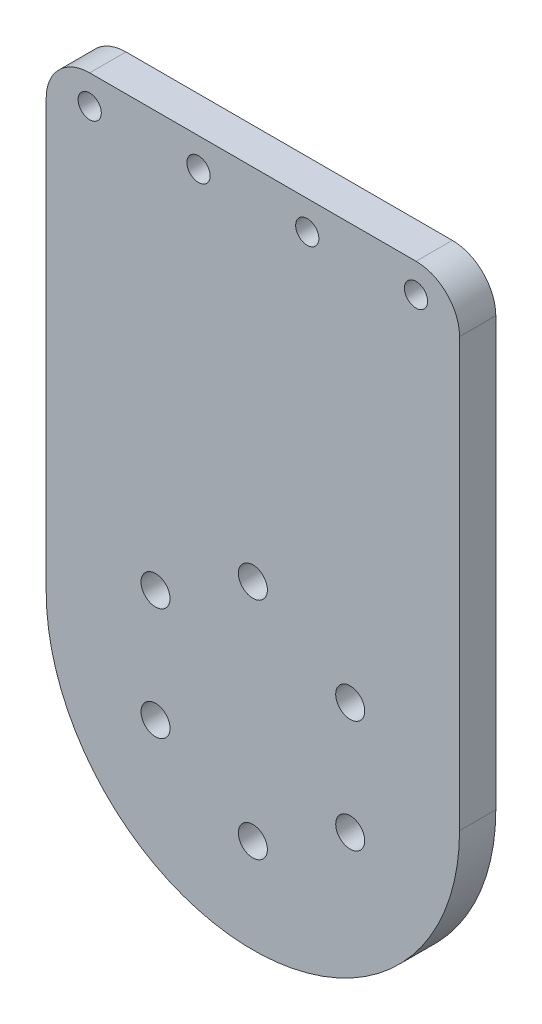
ISO-10303-21;
HEADER;
FILE_DESCRIPTION(('STEP AP214'),'2;1');
FILE_NAME('part.step','',(''),(''),'','','');
FILE_SCHEMA(('AUTOMOTIVE_DESIGN { 1 0 10303 214 1 1 1 1 }'));
ENDSEC;
DATA;
#1=APPLICATION_CONTEXT('core data for automotive mechanical design processes');
#2=APPLICATION_PROTOCOL_DEFINITION('international standard','automotive_design',2000,#1);
#3=PRODUCT_CONTEXT('',#1,'mechanical');
#4=PRODUCT('Part','Part','',(#3));
#5=PRODUCT_RELATED_PRODUCT_CATEGORY('part','',(#4));
#6=PRODUCT_DEFINITION_FORMATION('','',#4);
#7=PRODUCT_DEFINITION_CONTEXT('part definition',#1,'design');
#8=PRODUCT_DEFINITION('design','',#6,#7);
#9=PRODUCT_DEFINITION_SHAPE('','',#8);
#10=(LENGTH_UNIT() NAMED_UNIT(*) SI_UNIT(.MILLI.,.METRE.));
#11=(NAMED_UNIT(*) PLANE_ANGLE_UNIT() SI_UNIT($,.RADIAN.));
#12=(NAMED_UNIT(*) SI_UNIT($,.STERADIAN.) SOLID_ANGLE_UNIT());
#13=UNCERTAINTY_MEASURE_WITH_UNIT(LENGTH_MEASURE(1.E-05),#10,'distance_accuracy_value','');
#14=(GEOMETRIC_REPRESENTATION_CONTEXT(3) GLOBAL_UNCERTAINTY_ASSIGNED_CONTEXT((#13)) GLOBAL_UNIT_ASSIGNED_CONTEXT((#10,
#11,#12)) REPRESENTATION_CONTEXT('',''));
#15=CARTESIAN_POINT('',(0.,0.,0.));
#16=DIRECTION('',(0.,0.,1.));
#17=DIRECTION('',(1.,0.,0.));
#18=AXIS2_PLACEMENT_3D('',#15,#16,#17);
#19=CARTESIAN_POINT('',(-28.5,0.,5.));
#20=DIRECTION('',(1.,0.,0.));
#21=DIRECTION('',(0.,1.,0.));
#22=AXIS2_PLACEMENT_3D('',#19,#20,#21);
#23=PLANE('',#22);
#24=DIRECTION('',(0.,-1.,0.));
#25=VECTOR('',#24,1.);
#26=CARTESIAN_POINT('',(-28.5,0.,5.));
#27=LINE('',#26,#25);
#28=CARTESIAN_POINT('',(-28.5,59.,5.));
#29=VERTEX_POINT('',#28);
#30=CARTESIAN_POINT('',(-28.5,0.,5.));
#31=VERTEX_POINT('',#30);
#32=EDGE_CURVE('E94',#29,#31,#27,.T.);
#33=ORIENTED_EDGE('',*,*,#32,.F.);
#34=DIRECTION('',(0.,0.,-1.));
#35=VECTOR('',#34,1.);
#36=CARTESIAN_POINT('',(-28.5,59.,0.));
#37=LINE('',#36,#35);
#38=CARTESIAN_POINT('',(-28.5,59.,0.));
#39=VERTEX_POINT('',#38);
#40=EDGE_CURVE('E123',#29,#39,#37,.T.);
#41=ORIENTED_EDGE('',*,*,#40,.T.);
#42=DIRECTION('',(0.,-1.,0.));
#43=VECTOR('',#42,1.);
#44=CARTESIAN_POINT('',(-28.5,0.,0.));
#45=LINE('',#44,#43);
#46=CARTESIAN_POINT('',(-28.5,0.,0.));
#47=VERTEX_POINT('',#46);
#48=EDGE_CURVE('E120',#39,#47,#45,.T.);
#49=ORIENTED_EDGE('',*,*,#48,.T.);
#50=DIRECTION('',(0.,0.,-1.));
#51=VECTOR('',#50,1.);
#52=CARTESIAN_POINT('',(-28.5,0.,5.));
#53=LINE('',#52,#51);
#54=EDGE_CURVE('E113',#31,#47,#53,.T.);
#55=ORIENTED_EDGE('',*,*,#54,.F.);
#56=EDGE_LOOP('',(#33,#41,#49,#55));
#57=FACE_BOUND('',#56,.T.);
#58=ADVANCED_FACE('F42',(#57),#23,.F.);
#59=CARTESIAN_POINT('',(0.,0.,5.));
#60=DIRECTION('',(0.,0.,-1.));
#61=DIRECTION('',(-1.,0.,0.));
#62=AXIS2_PLACEMENT_3D('',#59,#60,#61);
#63=CYLINDRICAL_SURFACE('',#62,28.5);
#64=CARTESIAN_POINT('',(0.,0.,0.));
#65=DIRECTION('',(0.,0.,1.));
#66=DIRECTION('',(1.,0.,0.));
#67=AXIS2_PLACEMENT_3D('',#64,#65,#66);
#68=CIRCLE('',#67,28.5);
#69=CARTESIAN_POINT('',(28.5,0.,0.));
#70=VERTEX_POINT('',#69);
#71=EDGE_CURVE('E158',#47,#70,#68,.T.);
#72=ORIENTED_EDGE('',*,*,#71,.T.);
#73=DIRECTION('',(0.,0.,-1.));
#74=VECTOR('',#73,1.);
#75=CARTESIAN_POINT('',(28.5,0.,5.));
#76=LINE('',#75,#74);
#77=CARTESIAN_POINT('',(28.5,0.,5.));
#78=VERTEX_POINT('',#77);
#79=EDGE_CURVE('E115',#78,#70,#76,.T.);
#80=ORIENTED_EDGE('',*,*,#79,.F.);
#81=CARTESIAN_POINT('',(0.,0.,5.));
#82=DIRECTION('',(0.,0.,1.));
#83=DIRECTION('',(1.,0.,0.));
#84=AXIS2_PLACEMENT_3D('',#81,#82,#83);
#85=CIRCLE('',#84,28.5);
#86=EDGE_CURVE('E97',#31,#78,#85,.T.);
#87=ORIENTED_EDGE('',*,*,#86,.F.);
#88=ORIENTED_EDGE('',*,*,#54,.T.);
#89=EDGE_LOOP('',(#72,#80,#87,#88));
#90=FACE_BOUND('',#89,.T.);
#91=ADVANCED_FACE('F112',(#90),#63,.T.);
#92=CARTESIAN_POINT('',(28.5,0.,5.));
#93=DIRECTION('',(1.,0.,0.));
#94=DIRECTION('',(0.,1.,0.));
#95=AXIS2_PLACEMENT_3D('',#92,#93,#94);
#96=PLANE('',#95);
#97=DIRECTION('',(0.,-1.,0.));
#98=VECTOR('',#97,1.);
#99=CARTESIAN_POINT('',(28.5,0.,0.));
#100=LINE('',#99,#98);
#101=CARTESIAN_POINT('',(28.5,59.,0.));
#102=VERTEX_POINT('',#101);
#103=EDGE_CURVE('E156',#102,#70,#100,.T.);
#104=ORIENTED_EDGE('',*,*,#103,.F.);
#105=DIRECTION('',(0.,0.,-1.));
#106=VECTOR('',#105,1.);
#107=CARTESIAN_POINT('',(28.5,59.,5.));
#108=LINE('',#107,#106);
#109=CARTESIAN_POINT('',(28.5,59.,5.));
#110=VERTEX_POINT('',#109);
#111=EDGE_CURVE('E51',#102,#110,#108,.F.);
#112=ORIENTED_EDGE('',*,*,#111,.T.);
#113=DIRECTION('',(0.,-1.,0.));
#114=VECTOR('',#113,1.);
#115=CARTESIAN_POINT('',(28.5,0.,5.));
#116=LINE('',#115,#114);
#117=EDGE_CURVE('E117',#110,#78,#116,.T.);
#118=ORIENTED_EDGE('',*,*,#117,.T.);
#119=ORIENTED_EDGE('',*,*,#79,.T.);
#120=EDGE_LOOP('',(#104,#112,#118,#119));
#121=FACE_BOUND('',#120,.T.);
#122=ADVANCED_FACE('F289',(#121),#96,.T.);
#123=CARTESIAN_POINT('',(0.,65.,5.));
#124=DIRECTION('',(0.,1.,0.));
#125=DIRECTION('',(0.,0.,1.));
#126=AXIS2_PLACEMENT_3D('',#123,#124,#125);
#127=PLANE('',#126);
#128=DIRECTION('',(1.,0.,0.));
#129=VECTOR('',#128,1.);
#130=CARTESIAN_POINT('',(0.,65.,5.));
#131=LINE('',#130,#129);
#132=CARTESIAN_POINT('',(-22.5,65.,5.));
#133=VERTEX_POINT('',#132);
#134=CARTESIAN_POINT('',(22.5,65.,5.));
#135=VERTEX_POINT('',#134);
#136=EDGE_CURVE('E129',#133,#135,#131,.T.);
#137=ORIENTED_EDGE('',*,*,#136,.T.);
#138=DIRECTION('',(0.,0.,-1.));
#139=VECTOR('',#138,1.);
#140=CARTESIAN_POINT('',(22.5,65.,5.));
#141=LINE('',#140,#139);
#142=CARTESIAN_POINT('',(22.5,65.,0.));
#143=VERTEX_POINT('',#142);
#144=EDGE_CURVE('E140',#135,#143,#141,.T.);
#145=ORIENTED_EDGE('',*,*,#144,.T.);
#146=DIRECTION('',(1.,0.,0.));
#147=VECTOR('',#146,1.);
#148=CARTESIAN_POINT('',(0.,65.,0.));
#149=LINE('',#148,#147);
#150=CARTESIAN_POINT('',(-22.5,65.,0.));
#151=VERTEX_POINT('',#150);
#152=EDGE_CURVE('E107',#151,#143,#149,.T.);
#153=ORIENTED_EDGE('',*,*,#152,.F.);
#154=DIRECTION('',(0.,0.,-1.));
#155=VECTOR('',#154,1.);
#156=CARTESIAN_POINT('',(-22.5,65.,5.));
#157=LINE('',#156,#155);
#158=EDGE_CURVE('E135',#151,#133,#157,.F.);
#159=ORIENTED_EDGE('',*,*,#158,.T.);
#160=EDGE_LOOP('',(#137,#145,#153,#159));
#161=FACE_BOUND('',#160,.T.);
#162=ADVANCED_FACE('F150',(#161),#127,.T.);
#163=CARTESIAN_POINT('',(0.,0.,5.));
#164=DIRECTION('',(0.,0.,1.));
#165=DIRECTION('',(1.,0.,0.));
#166=AXIS2_PLACEMENT_3D('',#163,#164,#165);
#167=PLANE('',#166);
#168=CARTESIAN_POINT('',(-13.4233937586587,-7.75000000000016,5.));
#169=DIRECTION('',(0.,0.,1.));
#170=DIRECTION('',(0.50000000000001,-0.866025403784433,0.));
#171=AXIS2_PLACEMENT_3D('',#168,#169,#170);
#172=CIRCLE('',#171,2.00000000000001);
#173=CARTESIAN_POINT('',(-12.4233937586587,-9.48205080756903,5.));
#174=VERTEX_POINT('',#173);
#175=EDGE_CURVE('E223',#174,#174,#172,.T.);
#176=ORIENTED_EDGE('',*,*,#175,.F.);
#177=EDGE_LOOP('',(#176));
#178=FACE_BOUND('',#177,.T.);
#179=CARTESIAN_POINT('',(-13.4233937586589,7.74999999999987,5.));
#180=DIRECTION('',(0.,0.,1.));
#181=DIRECTION('',(-0.499999999999992,-0.866025403784443,0.));
#182=AXIS2_PLACEMENT_3D('',#179,#180,#181);
#183=CIRCLE('',#182,2.00000000000001);
#184=CARTESIAN_POINT('',(-14.4233937586589,6.01794919243098,5.));
#185=VERTEX_POINT('',#184);
#186=EDGE_CURVE('E222',#185,#185,#183,.T.);
#187=ORIENTED_EDGE('',*,*,#186,.F.);
#188=EDGE_LOOP('',(#187));
#189=FACE_BOUND('',#188,.T.);
#190=CARTESIAN_POINT('',(0.,15.5,5.));
#191=DIRECTION('',(0.,0.,1.));
#192=DIRECTION('',(-1.,0.,0.));
#193=AXIS2_PLACEMENT_3D('',#190,#191,#192);
#194=CIRCLE('',#193,2.00000000000001);
#195=CARTESIAN_POINT('',(-2.00000000000001,15.5,5.));
#196=VERTEX_POINT('',#195);
#197=EDGE_CURVE('E231',#196,#196,#194,.T.);
#198=ORIENTED_EDGE('',*,*,#197,.F.);
#199=EDGE_LOOP('',(#198));
#200=FACE_BOUND('',#199,.T.);
#201=CARTESIAN_POINT('',(13.4233937586588,7.75000000000006,5.));
#202=DIRECTION('',(0.,0.,1.));
#203=DIRECTION('',(-0.500000000000004,0.866025403784436,0.));
#204=AXIS2_PLACEMENT_3D('',#201,#202,#203);
#205=CIRCLE('',#204,2.00000000000001);
#206=CARTESIAN_POINT('',(12.4233937586588,9.48205080756894,5.));
#207=VERTEX_POINT('',#206);
#208=EDGE_CURVE('E239',#207,#207,#205,.T.);
#209=ORIENTED_EDGE('',*,*,#208,.F.);
#210=EDGE_LOOP('',(#209));
#211=FACE_BOUND('',#210,.T.);
#212=CARTESIAN_POINT('',(13.4233937586588,-7.74999999999997,5.));
#213=DIRECTION('',(0.,0.,1.));
#214=DIRECTION('',(0.499999999999998,0.86602540378444,0.));
#215=AXIS2_PLACEMENT_3D('',#212,#213,#214);
#216=CIRCLE('',#215,2.00000000000001);
#217=CARTESIAN_POINT('',(14.4233937586588,-6.01794919243109,5.));
#218=VERTEX_POINT('',#217);
#219=EDGE_CURVE('E213',#218,#218,#216,.T.);
#220=ORIENTED_EDGE('',*,*,#219,.F.);
#221=EDGE_LOOP('',(#220));
#222=FACE_BOUND('',#221,.T.);
#223=CARTESIAN_POINT('',(7.5,60.9999999999999,5.));
#224=DIRECTION('',(0.,0.,1.));
#225=DIRECTION('',(1.,0.,0.));
#226=AXIS2_PLACEMENT_3D('',#223,#224,#225);
#227=CIRCLE('',#226,1.6);
#228=CARTESIAN_POINT('',(9.1,60.9999999999999,5.));
#229=VERTEX_POINT('',#228);
#230=EDGE_CURVE('E195',#229,#229,#227,.T.);
#231=ORIENTED_EDGE('',*,*,#230,.F.);
#232=EDGE_LOOP('',(#231));
#233=FACE_BOUND('',#232,.T.);
#234=CARTESIAN_POINT('',(-7.5,60.9999999999998,5.));
#235=DIRECTION('',(0.,0.,1.));
#236=DIRECTION('',(1.,0.,0.));
#237=AXIS2_PLACEMENT_3D('',#234,#235,#236);
#238=CIRCLE('',#237,1.6);
#239=CARTESIAN_POINT('',(-5.9,60.9999999999998,5.));
#240=VERTEX_POINT('',#239);
#241=EDGE_CURVE('E186',#240,#240,#238,.T.);
#242=ORIENTED_EDGE('',*,*,#241,.F.);
#243=EDGE_LOOP('',(#242));
#244=FACE_BOUND('',#243,.T.);
#245=CARTESIAN_POINT('',(-22.5,60.9999999999997,5.));
#246=DIRECTION('',(0.,0.,1.));
#247=DIRECTION('',(1.,0.,0.));
#248=AXIS2_PLACEMENT_3D('',#245,#246,#247);
#249=CIRCLE('',#248,1.6);
#250=CARTESIAN_POINT('',(-20.9,60.9999999999997,5.));
#251=VERTEX_POINT('',#250);
#252=EDGE_CURVE('E202',#251,#251,#249,.T.);
#253=ORIENTED_EDGE('',*,*,#252,.F.);
#254=EDGE_LOOP('',(#253));
#255=FACE_BOUND('',#254,.T.);
#256=CARTESIAN_POINT('',(22.5,61.,5.));
#257=DIRECTION('',(0.,0.,1.));
#258=DIRECTION('',(1.,0.,0.));
#259=AXIS2_PLACEMENT_3D('',#256,#257,#258);
#260=CIRCLE('',#259,1.6);
#261=CARTESIAN_POINT('',(24.1,61.,5.));
#262=VERTEX_POINT('',#261);
#263=EDGE_CURVE('E178',#262,#262,#260,.T.);
#264=ORIENTED_EDGE('',*,*,#263,.F.);
#265=EDGE_LOOP('',(#264));
#266=FACE_BOUND('',#265,.T.);
#267=CARTESIAN_POINT('',(0.,-15.5,5.));
#268=DIRECTION('',(0.,0.,1.));
#269=DIRECTION('',(1.,0.,0.));
#270=AXIS2_PLACEMENT_3D('',#267,#268,#269);
#271=CIRCLE('',#270,2.00000000000001);
#272=CARTESIAN_POINT('',(2.00000000000001,-15.5,5.));
#273=VERTEX_POINT('',#272);
#274=EDGE_CURVE('E173',#273,#273,#271,.T.);
#275=ORIENTED_EDGE('',*,*,#274,.F.);
#276=EDGE_LOOP('',(#275));
#277=FACE_BOUND('',#276,.T.);
#278=ORIENTED_EDGE('',*,*,#117,.F.);
#279=CARTESIAN_POINT('',(22.5,59.,5.));
#280=DIRECTION('',(0.,0.,1.));
#281=DIRECTION('',(1.,0.,0.));
#282=AXIS2_PLACEMENT_3D('',#279,#280,#281);
#283=CIRCLE('',#282,6.);
#284=EDGE_CURVE('E12',#110,#135,#283,.T.);
#285=ORIENTED_EDGE('',*,*,#284,.T.);
#286=ORIENTED_EDGE('',*,*,#136,.F.);
#287=CARTESIAN_POINT('',(-22.5,59.,5.));
#288=DIRECTION('',(0.,0.,1.));
#289=DIRECTION('',(1.,0.,0.));
#290=AXIS2_PLACEMENT_3D('',#287,#288,#289);
#291=CIRCLE('',#290,6.);
#292=EDGE_CURVE('E101',#133,#29,#291,.T.);
#293=ORIENTED_EDGE('',*,*,#292,.T.);
#294=ORIENTED_EDGE('',*,*,#32,.T.);
#295=ORIENTED_EDGE('',*,*,#86,.T.);
#296=EDGE_LOOP('',(#278,#285,#286,#293,#294,#295));
#297=FACE_BOUND('',#296,.T.);
#298=ADVANCED_FACE('F96',(#178,#189,#200,#211,#222,#233,#244,#255,#266,#277,#297),#167,.T.);
#299=CARTESIAN_POINT('',(0.,0.,0.));
#300=DIRECTION('',(0.,0.,1.));
#301=DIRECTION('',(1.,0.,0.));
#302=AXIS2_PLACEMENT_3D('',#299,#300,#301);
#303=PLANE('',#302);
#304=CARTESIAN_POINT('',(-13.4233937586587,-7.75000000000016,0.));
#305=DIRECTION('',(0.,0.,1.));
#306=DIRECTION('',(1.,0.,0.));
#307=AXIS2_PLACEMENT_3D('',#304,#305,#306);
#308=CIRCLE('',#307,2.00000000000001);
#309=CARTESIAN_POINT('',(-11.4233937586587,-7.75000000000016,0.));
#310=VERTEX_POINT('',#309);
#311=EDGE_CURVE('E218',#310,#310,#308,.F.);
#312=ORIENTED_EDGE('',*,*,#311,.F.);
#313=EDGE_LOOP('',(#312));
#314=FACE_BOUND('',#313,.T.);
#315=CARTESIAN_POINT('',(-13.4233937586589,7.74999999999987,0.));
#316=DIRECTION('',(0.,0.,1.));
#317=DIRECTION('',(1.,0.,0.));
#318=AXIS2_PLACEMENT_3D('',#315,#316,#317);
#319=CIRCLE('',#318,2.00000000000001);
#320=CARTESIAN_POINT('',(-11.4233937586589,7.74999999999987,0.));
#321=VERTEX_POINT('',#320);
#322=EDGE_CURVE('E227',#321,#321,#319,.F.);
#323=ORIENTED_EDGE('',*,*,#322,.F.);
#324=EDGE_LOOP('',(#323));
#325=FACE_BOUND('',#324,.T.);
#326=CARTESIAN_POINT('',(0.,15.5,0.));
#327=DIRECTION('',(0.,0.,1.));
#328=DIRECTION('',(1.,0.,0.));
#329=AXIS2_PLACEMENT_3D('',#326,#327,#328);
#330=CIRCLE('',#329,2.00000000000001);
#331=CARTESIAN_POINT('',(2.00000000000001,15.5,0.));
#332=VERTEX_POINT('',#331);
#333=EDGE_CURVE('E235',#332,#332,#330,.F.);
#334=ORIENTED_EDGE('',*,*,#333,.F.);
#335=EDGE_LOOP('',(#334));
#336=FACE_BOUND('',#335,.T.);
#337=CARTESIAN_POINT('',(13.4233937586588,7.75000000000006,0.));
#338=DIRECTION('',(0.,0.,1.));
#339=DIRECTION('',(1.,0.,0.));
#340=AXIS2_PLACEMENT_3D('',#337,#338,#339);
#341=CIRCLE('',#340,2.00000000000001);
#342=CARTESIAN_POINT('',(15.4233937586588,7.75000000000006,0.));
#343=VERTEX_POINT('',#342);
#344=EDGE_CURVE('E217',#343,#343,#341,.F.);
#345=ORIENTED_EDGE('',*,*,#344,.F.);
#346=EDGE_LOOP('',(#345));
#347=FACE_BOUND('',#346,.T.);
#348=CARTESIAN_POINT('',(13.4233937586588,-7.74999999999997,0.));
#349=DIRECTION('',(0.,0.,1.));
#350=DIRECTION('',(1.,0.,0.));
#351=AXIS2_PLACEMENT_3D('',#348,#349,#350);
#352=CIRCLE('',#351,2.00000000000001);
#353=CARTESIAN_POINT('',(15.4233937586588,-7.74999999999997,0.));
#354=VERTEX_POINT('',#353);
#355=EDGE_CURVE('E206',#354,#354,#352,.F.);
#356=ORIENTED_EDGE('',*,*,#355,.F.);
#357=EDGE_LOOP('',(#356));
#358=FACE_BOUND('',#357,.T.);
#359=CARTESIAN_POINT('',(7.5,60.9999999999999,0.));
#360=DIRECTION('',(0.,0.,1.));
#361=DIRECTION('',(1.,0.,0.));
#362=AXIS2_PLACEMENT_3D('',#359,#360,#361);
#363=CIRCLE('',#362,1.6);
#364=CARTESIAN_POINT('',(9.1,60.9999999999999,0.));
#365=VERTEX_POINT('',#364);
#366=EDGE_CURVE('E182',#365,#365,#363,.T.);
#367=ORIENTED_EDGE('',*,*,#366,.T.);
#368=EDGE_LOOP('',(#367));
#369=FACE_BOUND('',#368,.T.);
#370=CARTESIAN_POINT('',(-7.5,60.9999999999998,0.));
#371=DIRECTION('',(0.,0.,1.));
#372=DIRECTION('',(1.,0.,0.));
#373=AXIS2_PLACEMENT_3D('',#370,#371,#372);
#374=CIRCLE('',#373,1.6);
#375=CARTESIAN_POINT('',(-5.9,60.9999999999998,0.));
#376=VERTEX_POINT('',#375);
#377=EDGE_CURVE('E190',#376,#376,#374,.T.);
#378=ORIENTED_EDGE('',*,*,#377,.T.);
#379=EDGE_LOOP('',(#378));
#380=FACE_BOUND('',#379,.T.);
#381=CARTESIAN_POINT('',(-22.5,60.9999999999997,0.));
#382=DIRECTION('',(0.,0.,1.));
#383=DIRECTION('',(1.,0.,0.));
#384=AXIS2_PLACEMENT_3D('',#381,#382,#383);
#385=CIRCLE('',#384,1.6);
#386=CARTESIAN_POINT('',(-20.9,60.9999999999997,0.));
#387=VERTEX_POINT('',#386);
#388=EDGE_CURVE('E191',#387,#387,#385,.T.);
#389=ORIENTED_EDGE('',*,*,#388,.T.);
#390=EDGE_LOOP('',(#389));
#391=FACE_BOUND('',#390,.T.);
#392=CARTESIAN_POINT('',(22.5,61.,0.));
#393=DIRECTION('',(0.,0.,1.));
#394=DIRECTION('',(1.,0.,0.));
#395=AXIS2_PLACEMENT_3D('',#392,#393,#394);
#396=CIRCLE('',#395,1.6);
#397=CARTESIAN_POINT('',(24.1,61.,0.));
#398=VERTEX_POINT('',#397);
#399=EDGE_CURVE('E177',#398,#398,#396,.T.);
#400=ORIENTED_EDGE('',*,*,#399,.T.);
#401=EDGE_LOOP('',(#400));
#402=FACE_BOUND('',#401,.T.);
#403=CARTESIAN_POINT('',(0.,-15.5,0.));
#404=DIRECTION('',(0.,0.,1.));
#405=DIRECTION('',(1.,0.,0.));
#406=AXIS2_PLACEMENT_3D('',#403,#404,#405);
#407=CIRCLE('',#406,2.00000000000001);
#408=CARTESIAN_POINT('',(2.00000000000001,-15.5,0.));
#409=VERTEX_POINT('',#408);
#410=EDGE_CURVE('E165',#409,#409,#407,.F.);
#411=ORIENTED_EDGE('',*,*,#410,.F.);
#412=EDGE_LOOP('',(#411));
#413=FACE_BOUND('',#412,.T.);
#414=ORIENTED_EDGE('',*,*,#152,.T.);
#415=CARTESIAN_POINT('',(22.5,59.,0.));
#416=DIRECTION('',(0.,0.,1.));
#417=DIRECTION('',(1.,0.,0.));
#418=AXIS2_PLACEMENT_3D('',#415,#416,#417);
#419=CIRCLE('',#418,6.);
#420=EDGE_CURVE('E65',#143,#102,#419,.F.);
#421=ORIENTED_EDGE('',*,*,#420,.T.);
#422=ORIENTED_EDGE('',*,*,#103,.T.);
#423=ORIENTED_EDGE('',*,*,#71,.F.);
#424=ORIENTED_EDGE('',*,*,#48,.F.);
#425=CARTESIAN_POINT('',(-22.5,59.,0.));
#426=DIRECTION('',(0.,0.,1.));
#427=DIRECTION('',(1.,0.,0.));
#428=AXIS2_PLACEMENT_3D('',#425,#426,#427);
#429=CIRCLE('',#428,6.);
#430=EDGE_CURVE('E127',#39,#151,#429,.F.);
#431=ORIENTED_EDGE('',*,*,#430,.T.);
#432=EDGE_LOOP('',(#414,#421,#422,#423,#424,#431));
#433=FACE_BOUND('',#432,.T.);
#434=ADVANCED_FACE('F154',(#314,#325,#336,#347,#358,#369,#380,#391,#402,#413,#433),#303,.F.);
#435=CARTESIAN_POINT('',(0.,-15.5,-0.00100000000000013));
#436=DIRECTION('',(0.,0.,1.));
#437=DIRECTION('',(1.,0.,0.));
#438=AXIS2_PLACEMENT_3D('',#435,#436,#437);
#439=CYLINDRICAL_SURFACE('',#438,2.00000000000001);
#440=ORIENTED_EDGE('',*,*,#274,.T.);
#441=EDGE_LOOP('',(#440));
#442=FACE_BOUND('',#441,.T.);
#443=ORIENTED_EDGE('',*,*,#410,.T.);
#444=EDGE_LOOP('',(#443));
#445=FACE_BOUND('',#444,.T.);
#446=ADVANCED_FACE('F269',(#442,#445),#439,.F.);
#447=CARTESIAN_POINT('',(22.5,61.,0.));
#448=DIRECTION('',(0.,0.,1.));
#449=DIRECTION('',(1.,0.,0.));
#450=AXIS2_PLACEMENT_3D('',#447,#448,#449);
#451=CYLINDRICAL_SURFACE('',#450,1.6);
#452=ORIENTED_EDGE('',*,*,#399,.F.);
#453=EDGE_LOOP('',(#452));
#454=FACE_BOUND('',#453,.T.);
#455=ORIENTED_EDGE('',*,*,#263,.T.);
#456=EDGE_LOOP('',(#455));
#457=FACE_BOUND('',#456,.T.);
#458=ADVANCED_FACE('F272',(#454,#457),#451,.F.);
#459=CARTESIAN_POINT('',(-22.5,60.9999999999997,0.));
#460=DIRECTION('',(0.,0.,1.));
#461=DIRECTION('',(1.,0.,0.));
#462=AXIS2_PLACEMENT_3D('',#459,#460,#461);
#463=CYLINDRICAL_SURFACE('',#462,1.6);
#464=ORIENTED_EDGE('',*,*,#388,.F.);
#465=EDGE_LOOP('',(#464));
#466=FACE_BOUND('',#465,.T.);
#467=ORIENTED_EDGE('',*,*,#252,.T.);
#468=EDGE_LOOP('',(#467));
#469=FACE_BOUND('',#468,.T.);
#470=ADVANCED_FACE('F375',(#466,#469),#463,.F.);
#471=CARTESIAN_POINT('',(-7.5,60.9999999999998,0.));
#472=DIRECTION('',(0.,0.,1.));
#473=DIRECTION('',(1.,0.,0.));
#474=AXIS2_PLACEMENT_3D('',#471,#472,#473);
#475=CYLINDRICAL_SURFACE('',#474,1.6);
#476=ORIENTED_EDGE('',*,*,#377,.F.);
#477=EDGE_LOOP('',(#476));
#478=FACE_BOUND('',#477,.T.);
#479=ORIENTED_EDGE('',*,*,#241,.T.);
#480=EDGE_LOOP('',(#479));
#481=FACE_BOUND('',#480,.T.);
#482=ADVANCED_FACE('F301',(#478,#481),#475,.F.);
#483=CARTESIAN_POINT('',(7.5,60.9999999999999,0.));
#484=DIRECTION('',(0.,0.,1.));
#485=DIRECTION('',(1.,0.,0.));
#486=AXIS2_PLACEMENT_3D('',#483,#484,#485);
#487=CYLINDRICAL_SURFACE('',#486,1.6);
#488=ORIENTED_EDGE('',*,*,#366,.F.);
#489=EDGE_LOOP('',(#488));
#490=FACE_BOUND('',#489,.T.);
#491=ORIENTED_EDGE('',*,*,#230,.T.);
#492=EDGE_LOOP('',(#491));
#493=FACE_BOUND('',#492,.T.);
#494=ADVANCED_FACE('F294',(#490,#493),#487,.F.);
#495=CARTESIAN_POINT('',(-22.5,59.,5.));
#496=DIRECTION('',(0.,0.,1.));
#497=DIRECTION('',(1.,0.,0.));
#498=AXIS2_PLACEMENT_3D('',#495,#496,#497);
#499=CYLINDRICAL_SURFACE('',#498,6.);
#500=ORIENTED_EDGE('',*,*,#292,.F.);
#501=ORIENTED_EDGE('',*,*,#158,.F.);
#502=ORIENTED_EDGE('',*,*,#430,.F.);
#503=ORIENTED_EDGE('',*,*,#40,.F.);
#504=EDGE_LOOP('',(#500,#501,#502,#503));
#505=FACE_BOUND('',#504,.T.);
#506=ADVANCED_FACE('F292',(#505),#499,.T.);
#507=CARTESIAN_POINT('',(22.5,59.,5.));
#508=DIRECTION('',(0.,0.,-1.));
#509=DIRECTION('',(-1.,0.,0.));
#510=AXIS2_PLACEMENT_3D('',#507,#508,#509);
#511=CYLINDRICAL_SURFACE('',#510,6.);
#512=ORIENTED_EDGE('',*,*,#284,.F.);
#513=ORIENTED_EDGE('',*,*,#111,.F.);
#514=ORIENTED_EDGE('',*,*,#420,.F.);
#515=ORIENTED_EDGE('',*,*,#144,.F.);
#516=EDGE_LOOP('',(#512,#513,#514,#515));
#517=FACE_BOUND('',#516,.T.);
#518=ADVANCED_FACE('F44',(#517),#511,.T.);
#519=CARTESIAN_POINT('',(13.4233937586588,-7.74999999999997,-0.00100000000000013));
#520=DIRECTION('',(0.,0.,1.));
#521=DIRECTION('',(1.,0.,0.));
#522=AXIS2_PLACEMENT_3D('',#519,#520,#521);
#523=CYLINDRICAL_SURFACE('',#522,2.00000000000001);
#524=ORIENTED_EDGE('',*,*,#219,.T.);
#525=EDGE_LOOP('',(#524));
#526=FACE_BOUND('',#525,.T.);
#527=ORIENTED_EDGE('',*,*,#355,.T.);
#528=EDGE_LOOP('',(#527));
#529=FACE_BOUND('',#528,.T.);
#530=ADVANCED_FACE('F300',(#526,#529),#523,.F.);
#531=CARTESIAN_POINT('',(13.4233937586588,7.75000000000006,-0.00100000000000013));
#532=DIRECTION('',(0.,0.,1.));
#533=DIRECTION('',(1.,0.,0.));
#534=AXIS2_PLACEMENT_3D('',#531,#532,#533);
#535=CYLINDRICAL_SURFACE('',#534,2.00000000000001);
#536=ORIENTED_EDGE('',*,*,#208,.T.);
#537=EDGE_LOOP('',(#536));
#538=FACE_BOUND('',#537,.T.);
#539=ORIENTED_EDGE('',*,*,#344,.T.);
#540=EDGE_LOOP('',(#539));
#541=FACE_BOUND('',#540,.T.);
#542=ADVANCED_FACE('F250',(#538,#541),#535,.F.);
#543=CARTESIAN_POINT('',(0.,15.5,-0.00100000000000013));
#544=DIRECTION('',(0.,0.,1.));
#545=DIRECTION('',(1.,0.,0.));
#546=AXIS2_PLACEMENT_3D('',#543,#544,#545);
#547=CYLINDRICAL_SURFACE('',#546,2.00000000000001);
#548=ORIENTED_EDGE('',*,*,#197,.T.);
#549=EDGE_LOOP('',(#548));
#550=FACE_BOUND('',#549,.T.);
#551=ORIENTED_EDGE('',*,*,#333,.T.);
#552=EDGE_LOOP('',(#551));
#553=FACE_BOUND('',#552,.T.);
#554=ADVANCED_FACE('F340',(#550,#553),#547,.F.);
#555=CARTESIAN_POINT('',(-13.4233937586589,7.74999999999987,-0.00100000000000013));
#556=DIRECTION('',(0.,0.,1.));
#557=DIRECTION('',(1.,0.,0.));
#558=AXIS2_PLACEMENT_3D('',#555,#556,#557);
#559=CYLINDRICAL_SURFACE('',#558,2.00000000000001);
#560=ORIENTED_EDGE('',*,*,#186,.T.);
#561=EDGE_LOOP('',(#560));
#562=FACE_BOUND('',#561,.T.);
#563=ORIENTED_EDGE('',*,*,#322,.T.);
#564=EDGE_LOOP('',(#563));
#565=FACE_BOUND('',#564,.T.);
#566=ADVANCED_FACE('F349',(#562,#565),#559,.F.);
#567=CARTESIAN_POINT('',(-13.4233937586587,-7.75000000000016,-0.00100000000000013));
#568=DIRECTION('',(0.,0.,1.));
#569=DIRECTION('',(1.,0.,0.));
#570=AXIS2_PLACEMENT_3D('',#567,#568,#569);
#571=CYLINDRICAL_SURFACE('',#570,2.00000000000001);
#572=ORIENTED_EDGE('',*,*,#175,.T.);
#573=EDGE_LOOP('',(#572));
#574=FACE_BOUND('',#573,.T.);
#575=ORIENTED_EDGE('',*,*,#311,.T.);
#576=EDGE_LOOP('',(#575));
#577=FACE_BOUND('',#576,.T.);
#578=ADVANCED_FACE('F359',(#574,#577),#571,.F.);
#579=CLOSED_SHELL('',(#58,#91,#122,#162,#298,#434,#446,#458,#470,#482,#494,#506,#518,#530,#542,
#554,#566,#578));
#580=MANIFOLD_SOLID_BREP('B2',#579);
#581=ADVANCED_BREP_SHAPE_REPRESENTATION('',(#18,#580),#14);
#582=SHAPE_DEFINITION_REPRESENTATION(#9,#581);
ENDSEC;
END-ISO-10303-21;
